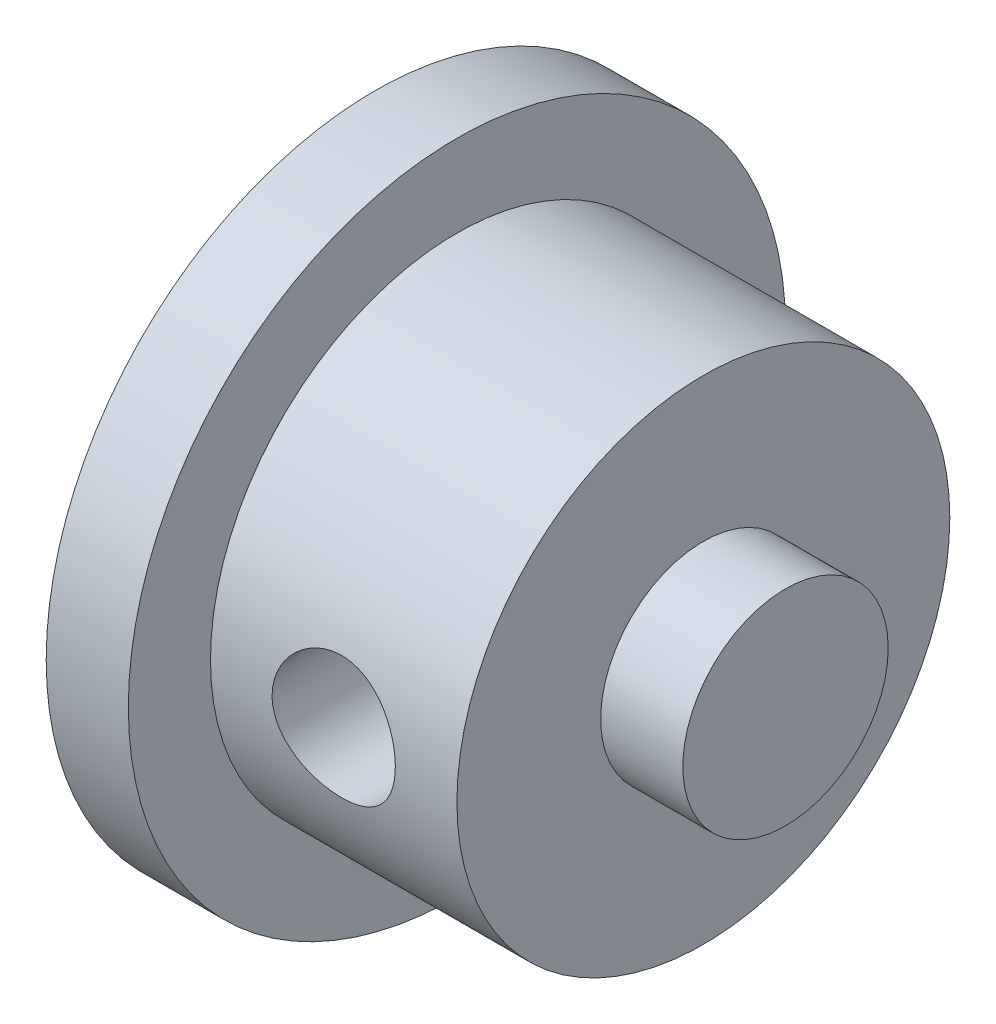
ISO-10303-21;
HEADER;
FILE_DESCRIPTION(('STEP AP214'),'2;1');
FILE_NAME('part.step','',(''),(''),'','','');
FILE_SCHEMA(('AUTOMOTIVE_DESIGN { 1 0 10303 214 1 1 1 1 }'));
ENDSEC;
DATA;
#1=APPLICATION_CONTEXT('core data for automotive mechanical design processes');
#2=APPLICATION_PROTOCOL_DEFINITION('international standard','automotive_design',2000,#1);
#3=PRODUCT_CONTEXT('',#1,'mechanical');
#4=PRODUCT('Part','Part','',(#3));
#5=PRODUCT_RELATED_PRODUCT_CATEGORY('part','',(#4));
#6=PRODUCT_DEFINITION_FORMATION('','',#4);
#7=PRODUCT_DEFINITION_CONTEXT('part definition',#1,'design');
#8=PRODUCT_DEFINITION('design','',#6,#7);
#9=PRODUCT_DEFINITION_SHAPE('','',#8);
#10=(LENGTH_UNIT() NAMED_UNIT(*) SI_UNIT(.MILLI.,.METRE.));
#11=(NAMED_UNIT(*) PLANE_ANGLE_UNIT() SI_UNIT($,.RADIAN.));
#12=(NAMED_UNIT(*) SI_UNIT($,.STERADIAN.) SOLID_ANGLE_UNIT());
#13=UNCERTAINTY_MEASURE_WITH_UNIT(LENGTH_MEASURE(1.E-05),#10,'distance_accuracy_value','');
#14=(GEOMETRIC_REPRESENTATION_CONTEXT(3) GLOBAL_UNCERTAINTY_ASSIGNED_CONTEXT((#13)) GLOBAL_UNIT_ASSIGNED_CONTEXT((#10,
#11,#12)) REPRESENTATION_CONTEXT('',''));
#15=CARTESIAN_POINT('',(0.,0.,0.));
#16=DIRECTION('',(0.,0.,1.));
#17=DIRECTION('',(1.,0.,0.));
#18=AXIS2_PLACEMENT_3D('',#15,#16,#17);
#19=CARTESIAN_POINT('',(-85.1360818211514,-18.2560029817697,0.));
#20=DIRECTION('',(-1.,0.,0.));
#21=DIRECTION('',(0.,0.,1.));
#22=AXIS2_PLACEMENT_3D('',#19,#20,#21);
#23=CYLINDRICAL_SURFACE('',#22,8.);
#24=CARTESIAN_POINT('',(-85.1360818211514,-18.2560029817697,0.));
#25=DIRECTION('',(-1.,0.,0.));
#26=DIRECTION('',(0.,0.,1.));
#27=AXIS2_PLACEMENT_3D('',#24,#25,#26);
#28=CIRCLE('',#27,8.);
#29=CARTESIAN_POINT('',(-85.1360818211514,-18.2560029817697,8.));
#30=VERTEX_POINT('',#29);
#31=EDGE_CURVE('E50',#30,#30,#28,.T.);
#32=ORIENTED_EDGE('',*,*,#31,.F.);
#33=EDGE_LOOP('',(#32));
#34=FACE_BOUND('',#33,.T.);
#35=CARTESIAN_POINT('',(-83.1360818211514,-18.2560029817697,0.));
#36=DIRECTION('',(-1.,0.,0.));
#37=DIRECTION('',(0.,0.,1.));
#38=AXIS2_PLACEMENT_3D('',#35,#36,#37);
#39=CIRCLE('',#38,8.);
#40=CARTESIAN_POINT('',(-83.1360818211514,-18.2560029817697,8.));
#41=VERTEX_POINT('',#40);
#42=EDGE_CURVE('E66',#41,#41,#39,.T.);
#43=ORIENTED_EDGE('',*,*,#42,.T.);
#44=EDGE_LOOP('',(#43));
#45=FACE_BOUND('',#44,.T.);
#46=ADVANCED_FACE('F37',(#34,#45),#23,.T.);
#47=CARTESIAN_POINT('',(-85.1360818211514,-10.2560029817697,0.));
#48=DIRECTION('',(1.,0.,0.));
#49=DIRECTION('',(0.,0.,-1.));
#50=AXIS2_PLACEMENT_3D('',#47,#48,#49);
#51=PLANE('',#50);
#52=ORIENTED_EDGE('',*,*,#31,.T.);
#53=EDGE_LOOP('',(#52));
#54=FACE_BOUND('',#53,.T.);
#55=ADVANCED_FACE('F94',(#54),#51,.F.);
#56=CARTESIAN_POINT('',(-85.1360818211514,-18.2560029817697,0.));
#57=DIRECTION('',(-1.,0.,0.));
#58=DIRECTION('',(0.,0.,1.));
#59=AXIS2_PLACEMENT_3D('',#56,#57,#58);
#60=CYLINDRICAL_SURFACE('',#59,6.);
#61=CARTESIAN_POINT('',(-78.6360818211514,-18.2560029817697,6.));
#62=CARTESIAN_POINT('',(-78.6360841468896,-18.3388790704394,5.99999859868013));
#63=CARTESIAN_POINT('',(-78.6429733719252,-18.4217811396004,5.99826578131828));
#64=CARTESIAN_POINT('',(-78.6703069724584,-18.5852093055402,5.99152113829892));
#65=CARTESIAN_POINT('',(-78.6907590306893,-18.6657340286404,5.98650745419968));
#66=CARTESIAN_POINT('',(-78.7445210746135,-18.8220238539523,5.9737562633204));
#67=CARTESIAN_POINT('',(-78.7778156198667,-18.8977945451997,5.96602202842087));
#68=CARTESIAN_POINT('',(-78.8562632111963,-19.0426751136741,5.94865343807593));
#69=CARTESIAN_POINT('',(-78.9014166572703,-19.1117847661184,5.9390190185405));
#70=CARTESIAN_POINT('',(-79.0032826108056,-19.2428049090706,5.91867413591801));
#71=CARTESIAN_POINT('',(-79.0601933961106,-19.3045586718308,5.90794707148533));
#72=CARTESIAN_POINT('',(-79.1835340260603,-19.417751908973,5.88673620117529));
#73=CARTESIAN_POINT('',(-79.2499649440979,-19.4691902187188,5.87625242288348));
#74=CARTESIAN_POINT('',(-79.3916770478888,-19.5610295245687,5.8565477569971));
#75=CARTESIAN_POINT('',(-79.4670750519618,-19.601255197695,5.84734794470605));
#76=CARTESIAN_POINT('',(-79.6238302328098,-19.6683998903202,5.83149494812223));
#77=CARTESIAN_POINT('',(-79.7051864544772,-19.695321037209,5.82484135672789));
#78=CARTESIAN_POINT('',(-79.8698253193539,-19.734557818574,5.81500476717551));
#79=CARTESIAN_POINT('',(-79.9530367172012,-19.747155250103,5.81175491075426));
#80=CARTESIAN_POINT('',(-80.1204503901654,-19.7582647568375,5.80889362537741));
#81=CARTESIAN_POINT('',(-80.20465250185,-19.7567791235876,5.80928160448644));
#82=CARTESIAN_POINT('',(-80.3694976288959,-19.7399895064089,5.81359205496618));
#83=CARTESIAN_POINT('',(-80.4501774426165,-19.7250213219602,5.81742863001879));
#84=CARTESIAN_POINT('',(-80.6078428720627,-19.6822271686728,5.82806709676484));
#85=CARTESIAN_POINT('',(-80.6848282241804,-19.6544002838391,5.83486919970697));
#86=CARTESIAN_POINT('',(-80.8338198374035,-19.5863924597068,5.85075113904187));
#87=CARTESIAN_POINT('',(-80.905767992941,-19.5460896490026,5.85985327469421));
#88=CARTESIAN_POINT('',(-81.0420005309083,-19.4543592577846,5.87929710846386));
#89=CARTESIAN_POINT('',(-81.1062835692187,-19.4029297305785,5.88963902334736));
#90=CARTESIAN_POINT('',(-81.2272854368458,-19.2886664064509,5.91075880539781));
#91=CARTESIAN_POINT('',(-81.2837363112128,-19.2255492399355,5.92154069477972));
#92=CARTESIAN_POINT('',(-81.3853030636153,-19.0906148992734,5.94205965578786));
#93=CARTESIAN_POINT('',(-81.430418595415,-19.0187974594776,5.95179669549415));
#94=CARTESIAN_POINT('',(-81.5081324073758,-18.8681188704511,5.96917732094183));
#95=CARTESIAN_POINT('',(-81.5406871614058,-18.7892343749783,5.97681360127725));
#96=CARTESIAN_POINT('',(-81.591999126861,-18.6268789899125,5.98907916991419));
#97=CARTESIAN_POINT('',(-81.6107589775695,-18.5434089809201,5.99370903339281));
#98=CARTESIAN_POINT('',(-81.6335393867102,-18.3765429521597,5.99935499271375));
#99=CARTESIAN_POINT('',(-81.6379248472267,-18.2931997017579,6.00046053508279));
#100=CARTESIAN_POINT('',(-81.6328328190959,-18.1269701069682,5.99918804814451));
#101=CARTESIAN_POINT('',(-81.6233565783523,-18.0440837221251,5.99681033241846));
#102=CARTESIAN_POINT('',(-81.59111091276,-17.8823887129932,5.98889581127357));
#103=CARTESIAN_POINT('',(-81.5685405576744,-17.8035378628009,5.98340634185811));
#104=CARTESIAN_POINT('',(-81.510974737123,-17.6507456893172,5.96988706634134));
#105=CARTESIAN_POINT('',(-81.4759780168382,-17.576804862737,5.96185700369892));
#106=CARTESIAN_POINT('',(-81.3938456922767,-17.4344798473398,5.9439330792631));
#107=CARTESIAN_POINT('',(-81.3465057087546,-17.3662175399338,5.93400867366932));
#108=CARTESIAN_POINT('',(-81.2412919123544,-17.2384763681264,5.91344509187419));
#109=CARTESIAN_POINT('',(-81.1834162815345,-17.1789990227967,5.90280579251705));
#110=CARTESIAN_POINT('',(-81.0570798603069,-17.0690124136969,5.88168956960771));
#111=CARTESIAN_POINT('',(-80.988394118149,-17.0187591141476,5.87122304187281));
#112=CARTESIAN_POINT('',(-80.8433491866857,-16.930492222757,5.85192878377239));
#113=CARTESIAN_POINT('',(-80.7669903381916,-16.8924780876117,5.84310098067026));
#114=CARTESIAN_POINT('',(-80.6091760987383,-16.8300515611604,5.82818094734665));
#115=CARTESIAN_POINT('',(-80.5277541928074,-16.8055585851156,5.82207255291906));
#116=CARTESIAN_POINT('',(-80.3617721832623,-16.7706573218159,5.81326744090183));
#117=CARTESIAN_POINT('',(-80.2772127701189,-16.760245954291,5.81056997719936));
#118=CARTESIAN_POINT('',(-80.1099607972962,-16.7539643914357,5.80894901203957));
#119=CARTESIAN_POINT('',(-80.0272843860267,-16.7576850839896,5.80991932728264));
#120=CARTESIAN_POINT('',(-79.8637779324834,-16.7786257034568,5.81527909007843));
#121=CARTESIAN_POINT('',(-79.7829478531377,-16.7958453590829,5.81966846891857));
#122=CARTESIAN_POINT('',(-79.625873362086,-16.8430716623269,5.83131260682722));
#123=CARTESIAN_POINT('',(-79.5496045159112,-16.8730015770893,5.83855015236309));
#124=CARTESIAN_POINT('',(-79.4031164384377,-16.9447380681646,5.85507755724829));
#125=CARTESIAN_POINT('',(-79.3328980479645,-16.9865462917355,5.86436770120773));
#126=CARTESIAN_POINT('',(-79.1985271921494,-17.0821352331325,5.88425634263512));
#127=CARTESIAN_POINT('',(-79.1345807477274,-17.1361998188574,5.89488264831757));
#128=CARTESIAN_POINT('',(-79.016534776356,-17.2542136105799,5.91608027246286));
#129=CARTESIAN_POINT('',(-78.9624375910384,-17.3181651605085,5.9266515772706));
#130=CARTESIAN_POINT('',(-78.8646705125868,-17.4555353950671,5.94677655647663));
#131=CARTESIAN_POINT('',(-78.8212072074798,-17.5291045594533,5.95630833365868));
#132=CARTESIAN_POINT('',(-78.7473343582109,-17.6827369222592,5.97304924975119));
#133=CARTESIAN_POINT('',(-78.7169154605029,-17.7627954183329,5.98026005199781));
#134=CARTESIAN_POINT('',(-78.6745099908218,-17.9115927285262,5.99048059565542));
#135=CARTESIAN_POINT('',(-78.660130578098,-17.9796228108616,5.99402585052691));
#136=CARTESIAN_POINT('',(-78.6409158775295,-18.1170969102334,5.99878605231948));
#137=CARTESIAN_POINT('',(-78.6360798718461,-18.1865408205271,6.00000117450894));
#138=CARTESIAN_POINT('',(-78.6360818211514,-18.2560029817697,6.));
#139=B_SPLINE_CURVE_WITH_KNOTS('',3,(#61,#62,#63,#64,#65,#66,#67,#68,#69,#70,#71,#72,#73,#74,
#75,#76,#77,#78,#79,#80,#81,#82,#83,#84,#85,#86,#87,#88,#89,#90,#91,#92,#93,#94,#95,#96,#97,#98,
#99,#100,#101,#102,#103,#104,#105,#106,#107,#108,#109,#110,#111,#112,#113,#114,#115,#116,#117,
#118,#119,#120,#121,#122,#123,#124,#125,#126,#127,#128,#129,#130,#131,#132,#133,#134,#135,#136,
#137,#138),.UNSPECIFIED.,.T.,.F.,(4,2,2,2,2,2,2,2,2,2,2,2,2,2,2,2,2,2,2,2,2,2,2,2,2,2,2,2,2,2,2,
2,2,2,2,2,2,2,4),(0.,0.248373712471887,0.496888237763901,0.745104902286106,0.993329940169331,
1.2461443543714,1.49898729580063,1.75558647545808,2.01214461169367,2.26356295099428,
2.51494038112696,2.76022497007017,3.00552703466038,3.2533052787388,3.50112690836163,
3.75601500969019,4.01091089558247,4.26668229009114,4.52240473688643,4.77158308949276,
5.02073901112742,5.26620274514037,5.5116912732229,5.76153587565351,6.01142363008018,
6.26744509204475,6.52345518749507,6.77792254614035,7.03233423252408,7.27943780398612,
7.52653640956035,7.77216400559447,8.017825681369,8.26989576409909,8.52202569770418,
8.77872185499588,9.03523363821349,9.24342242942148,9.45159556043038),.UNSPECIFIED.);
#140=CARTESIAN_POINT('',(-78.6360818211514,-18.2560029817697,6.));
#141=VERTEX_POINT('',#140);
#142=EDGE_CURVE('E40',#141,#141,#139,.T.);
#143=ORIENTED_EDGE('',*,*,#142,.T.);
#144=EDGE_LOOP('',(#143));
#145=FACE_BOUND('',#144,.T.);
#146=CARTESIAN_POINT('',(-78.6360818211514,-18.2560029817697,-6.));
#147=CARTESIAN_POINT('',(-78.6360841468896,-18.1731268930999,-5.99999859868013));
#148=CARTESIAN_POINT('',(-78.6429733719252,-18.0902248239389,-5.99826578131828));
#149=CARTESIAN_POINT('',(-78.6703069724584,-17.9267966579991,-5.99152113829892));
#150=CARTESIAN_POINT('',(-78.6907590306893,-17.8462719348989,-5.98650745419968));
#151=CARTESIAN_POINT('',(-78.7445210746135,-17.6899821095871,-5.9737562633204));
#152=CARTESIAN_POINT('',(-78.7778156198667,-17.6142114183397,-5.96602202842087));
#153=CARTESIAN_POINT('',(-78.8562632111963,-17.4693308498652,-5.94865343807593));
#154=CARTESIAN_POINT('',(-78.9014166572703,-17.4002211974209,-5.9390190185405));
#155=CARTESIAN_POINT('',(-79.0032826108056,-17.2692010544688,-5.91867413591801));
#156=CARTESIAN_POINT('',(-79.0601933961106,-17.2074472917086,-5.90794707148533));
#157=CARTESIAN_POINT('',(-79.1835340260603,-17.0942540545664,-5.88673620117529));
#158=CARTESIAN_POINT('',(-79.2499649440979,-17.0428157448205,-5.87625242288348));
#159=CARTESIAN_POINT('',(-79.3916770478888,-16.9509764389706,-5.8565477569971));
#160=CARTESIAN_POINT('',(-79.4670750519618,-16.9107507658443,-5.84734794470605));
#161=CARTESIAN_POINT('',(-79.6238302328098,-16.8436060732191,-5.83149494812223));
#162=CARTESIAN_POINT('',(-79.7051864544772,-16.8166849263303,-5.82484135672789));
#163=CARTESIAN_POINT('',(-79.8698253193539,-16.7774481449654,-5.81500476717551));
#164=CARTESIAN_POINT('',(-79.9530367172012,-16.7648507134363,-5.81175491075426));
#165=CARTESIAN_POINT('',(-80.1204503901654,-16.7537412067018,-5.80889362537741));
#166=CARTESIAN_POINT('',(-80.20465250185,-16.7552268399517,-5.80928160448644));
#167=CARTESIAN_POINT('',(-80.3694976288959,-16.7720164571304,-5.81359205496618));
#168=CARTESIAN_POINT('',(-80.4501774426165,-16.7869846415792,-5.81742863001879));
#169=CARTESIAN_POINT('',(-80.6078428720627,-16.8297787948666,-5.82806709676484));
#170=CARTESIAN_POINT('',(-80.6848282241804,-16.8576056797003,-5.83486919970696));
#171=CARTESIAN_POINT('',(-80.8338198374035,-16.9256135038325,-5.85075113904187));
#172=CARTESIAN_POINT('',(-80.905767992941,-16.9659163145368,-5.85985327469421));
#173=CARTESIAN_POINT('',(-81.0420005309083,-17.0576467057547,-5.87929710846386));
#174=CARTESIAN_POINT('',(-81.1062835692187,-17.1090762329608,-5.88963902334735));
#175=CARTESIAN_POINT('',(-81.2272854368458,-17.2233395570885,-5.91075880539781));
#176=CARTESIAN_POINT('',(-81.2837363112128,-17.2864567236038,-5.92154069477971));
#177=CARTESIAN_POINT('',(-81.3853030636153,-17.421391064266,-5.94205965578786));
#178=CARTESIAN_POINT('',(-81.430418595415,-17.4932085040617,-5.95179669549415));
#179=CARTESIAN_POINT('',(-81.5081324073758,-17.6438870930883,-5.96917732094182));
#180=CARTESIAN_POINT('',(-81.5406871614058,-17.722771588561,-5.97681360127725));
#181=CARTESIAN_POINT('',(-81.591999126861,-17.8851269736268,-5.98907916991418));
#182=CARTESIAN_POINT('',(-81.6107589775695,-17.9685969826192,-5.99370903339281));
#183=CARTESIAN_POINT('',(-81.6335393867102,-18.1354630113797,-5.99935499271375));
#184=CARTESIAN_POINT('',(-81.6379248472267,-18.2188062617815,-6.00046053508279));
#185=CARTESIAN_POINT('',(-81.6328328190959,-18.3850358565712,-5.99918804814451));
#186=CARTESIAN_POINT('',(-81.6233565783523,-18.4679222414143,-5.99681033241846));
#187=CARTESIAN_POINT('',(-81.59111091276,-18.6296172505462,-5.98889581127357));
#188=CARTESIAN_POINT('',(-81.5685405576744,-18.7084681007384,-5.98340634185811));
#189=CARTESIAN_POINT('',(-81.510974737123,-18.8612602742222,-5.96988706634134));
#190=CARTESIAN_POINT('',(-81.4759780168382,-18.9352011008023,-5.96185700369892));
#191=CARTESIAN_POINT('',(-81.3938456922767,-19.0775261161995,-5.9439330792631));
#192=CARTESIAN_POINT('',(-81.3465057087546,-19.1457884236055,-5.93400867366932));
#193=CARTESIAN_POINT('',(-81.2412919123544,-19.2735295954129,-5.91344509187419));
#194=CARTESIAN_POINT('',(-81.1834162815345,-19.3330069407427,-5.90280579251705));
#195=CARTESIAN_POINT('',(-81.0570798603069,-19.4429935498424,-5.88168956960771));
#196=CARTESIAN_POINT('',(-80.988394118149,-19.4932468493917,-5.87122304187281));
#197=CARTESIAN_POINT('',(-80.8433491866857,-19.5815137407824,-5.85192878377239));
#198=CARTESIAN_POINT('',(-80.7669903381916,-19.6195278759276,-5.84310098067026));
#199=CARTESIAN_POINT('',(-80.6091760987383,-19.681954402379,-5.82818094734665));
#200=CARTESIAN_POINT('',(-80.5277541928074,-19.7064473784237,-5.82207255291906));
#201=CARTESIAN_POINT('',(-80.3617721832623,-19.7413486417234,-5.81326744090184));
#202=CARTESIAN_POINT('',(-80.2772127701189,-19.7517600092483,-5.81056997719936));
#203=CARTESIAN_POINT('',(-80.1099607972962,-19.7580415721037,-5.80894901203957));
#204=CARTESIAN_POINT('',(-80.0272843860267,-19.7543208795498,-5.80991932728264));
#205=CARTESIAN_POINT('',(-79.8637779324834,-19.7333802600825,-5.81527909007843));
#206=CARTESIAN_POINT('',(-79.7829478531377,-19.7161606044564,-5.81966846891857));
#207=CARTESIAN_POINT('',(-79.625873362086,-19.6689343012125,-5.83131260682723));
#208=CARTESIAN_POINT('',(-79.5496045159112,-19.63900438645,-5.8385501523631));
#209=CARTESIAN_POINT('',(-79.4031164384377,-19.5672678953747,-5.85507755724829));
#210=CARTESIAN_POINT('',(-79.3328980479645,-19.5254596718039,-5.86436770120773));
#211=CARTESIAN_POINT('',(-79.1985271921494,-19.4298707304068,-5.88425634263512));
#212=CARTESIAN_POINT('',(-79.1345807477274,-19.3758061446819,-5.89488264831757));
#213=CARTESIAN_POINT('',(-79.016534776356,-19.2577923529594,-5.91608027246286));
#214=CARTESIAN_POINT('',(-78.9624375910384,-19.1938408030308,-5.9266515772706));
#215=CARTESIAN_POINT('',(-78.8646705125868,-19.0564705684723,-5.94677655647663));
#216=CARTESIAN_POINT('',(-78.8212072074798,-18.9829014040861,-5.95630833365868));
#217=CARTESIAN_POINT('',(-78.7473343582109,-18.8292690412801,-5.97304924975118));
#218=CARTESIAN_POINT('',(-78.7169154605029,-18.7492105452064,-5.98026005199781));
#219=CARTESIAN_POINT('',(-78.6745099908218,-18.6004132350131,-5.99048059565542));
#220=CARTESIAN_POINT('',(-78.660130578098,-18.5323831526777,-5.99402585052691));
#221=CARTESIAN_POINT('',(-78.6409158775295,-18.394909053306,-5.99878605231948));
#222=CARTESIAN_POINT('',(-78.6360798718461,-18.3254651430123,-6.00000117450894));
#223=CARTESIAN_POINT('',(-78.6360818211514,-18.2560029817697,-6.));
#224=B_SPLINE_CURVE_WITH_KNOTS('',3,(#146,#147,#148,#149,#150,#151,#152,#153,#154,#155,#156,
#157,#158,#159,#160,#161,#162,#163,#164,#165,#166,#167,#168,#169,#170,#171,#172,#173,#174,#175,
#176,#177,#178,#179,#180,#181,#182,#183,#184,#185,#186,#187,#188,#189,#190,#191,#192,#193,#194,
#195,#196,#197,#198,#199,#200,#201,#202,#203,#204,#205,#206,#207,#208,#209,#210,#211,#212,#213,
#214,#215,#216,#217,#218,#219,#220,#221,#222,#223),.UNSPECIFIED.,.T.,.F.,(4,2,2,2,2,2,2,2,2,2,2,
2,2,2,2,2,2,2,2,2,2,2,2,2,2,2,2,2,2,2,2,2,2,2,2,2,2,2,4),(0.,0.248373712471891,
0.496888237763901,0.745104902286109,0.993329940169328,1.2461443543714,1.49898729580061,
1.75558647545806,2.01214461169367,2.2635629509943,2.51494038112696,2.76022497007017,
3.00552703466038,3.25330527873879,3.50112690836162,3.75601500969018,4.01091089558246,
4.26668229009113,4.52240473688643,4.77158308949276,5.02073901112742,5.26620274514037,
5.5116912732229,5.76153587565352,6.01142363008018,6.26744509204475,6.52345518749507,
6.77792254614035,7.03233423252407,7.27943780398612,7.52653640956034,7.77216400559447,
8.01782568136901,8.26989576409909,8.52202569770416,8.77872185499587,9.03523363821349,
9.24342242942148,9.45159556043038),.UNSPECIFIED.);
#225=CARTESIAN_POINT('',(-78.6360818211514,-18.2560029817697,-6.));
#226=VERTEX_POINT('',#225);
#227=EDGE_CURVE('E65',#226,#226,#224,.T.);
#228=ORIENTED_EDGE('',*,*,#227,.T.);
#229=EDGE_LOOP('',(#228));
#230=FACE_BOUND('',#229,.T.);
#231=CARTESIAN_POINT('',(-83.1360818211514,-18.2560029817697,0.));
#232=DIRECTION('',(-1.,0.,0.));
#233=DIRECTION('',(0.,0.,1.));
#234=AXIS2_PLACEMENT_3D('',#231,#232,#233);
#235=CIRCLE('',#234,6.);
#236=CARTESIAN_POINT('',(-83.1360818211514,-18.2560029817697,6.));
#237=VERTEX_POINT('',#236);
#238=EDGE_CURVE('E56',#237,#237,#235,.T.);
#239=ORIENTED_EDGE('',*,*,#238,.F.);
#240=EDGE_LOOP('',(#239));
#241=FACE_BOUND('',#240,.T.);
#242=CARTESIAN_POINT('',(-77.1360818211514,-18.2560029817697,0.));
#243=DIRECTION('',(1.,0.,0.));
#244=DIRECTION('',(0.,0.,-1.));
#245=AXIS2_PLACEMENT_3D('',#242,#243,#244);
#246=CIRCLE('',#245,6.);
#247=CARTESIAN_POINT('',(-77.1360818211514,-18.2560029817697,-6.));
#248=VERTEX_POINT('',#247);
#249=EDGE_CURVE('E61',#248,#248,#246,.T.);
#250=ORIENTED_EDGE('',*,*,#249,.F.);
#251=EDGE_LOOP('',(#250));
#252=FACE_BOUND('',#251,.T.);
#253=ADVANCED_FACE('F77',(#145,#230,#241,#252),#60,.T.);
#254=CARTESIAN_POINT('',(-83.1360818211514,-12.2560029817697,0.));
#255=DIRECTION('',(-1.,0.,0.));
#256=DIRECTION('',(0.,0.,1.));
#257=AXIS2_PLACEMENT_3D('',#254,#255,#256);
#258=PLANE('',#257);
#259=ORIENTED_EDGE('',*,*,#42,.F.);
#260=EDGE_LOOP('',(#259));
#261=FACE_BOUND('',#260,.T.);
#262=ORIENTED_EDGE('',*,*,#238,.T.);
#263=EDGE_LOOP('',(#262));
#264=FACE_BOUND('',#263,.T.);
#265=ADVANCED_FACE('F85',(#261,#264),#258,.F.);
#266=CARTESIAN_POINT('',(-80.1360818211514,-18.2560029817697,-8.00000000000002));
#267=DIRECTION('',(0.,0.,1.));
#268=DIRECTION('',(1.,0.,0.));
#269=AXIS2_PLACEMENT_3D('',#266,#267,#268);
#270=CYLINDRICAL_SURFACE('',#269,1.5);
#271=ORIENTED_EDGE('',*,*,#227,.F.);
#272=EDGE_LOOP('',(#271));
#273=FACE_BOUND('',#272,.T.);
#274=ORIENTED_EDGE('',*,*,#142,.F.);
#275=EDGE_LOOP('',(#274));
#276=FACE_BOUND('',#275,.T.);
#277=ADVANCED_FACE('F80',(#273,#276),#270,.F.);
#278=CARTESIAN_POINT('',(-77.1360818211514,-18.2560029817697,0.));
#279=DIRECTION('',(1.,0.,0.));
#280=DIRECTION('',(0.,0.,-1.));
#281=AXIS2_PLACEMENT_3D('',#278,#279,#280);
#282=PLANE('',#281);
#283=CARTESIAN_POINT('',(-77.1360818211514,-18.2560029817697,0.));
#284=DIRECTION('',(1.,0.,0.));
#285=DIRECTION('',(0.,0.,-1.));
#286=AXIS2_PLACEMENT_3D('',#283,#284,#285);
#287=CIRCLE('',#286,2.5);
#288=CARTESIAN_POINT('',(-77.1360818211514,-18.2560029817697,-2.5));
#289=VERTEX_POINT('',#288);
#290=EDGE_CURVE('E10',#289,#289,#287,.T.);
#291=ORIENTED_EDGE('',*,*,#290,.F.);
#292=EDGE_LOOP('',(#291));
#293=FACE_BOUND('',#292,.T.);
#294=ORIENTED_EDGE('',*,*,#249,.T.);
#295=EDGE_LOOP('',(#294));
#296=FACE_BOUND('',#295,.T.);
#297=ADVANCED_FACE('F84',(#293,#296),#282,.T.);
#298=CARTESIAN_POINT('',(-75.1360818211514,-18.2560029817697,0.));
#299=DIRECTION('',(-1.,0.,0.));
#300=DIRECTION('',(0.,0.,1.));
#301=AXIS2_PLACEMENT_3D('',#298,#299,#300);
#302=CYLINDRICAL_SURFACE('',#301,2.5);
#303=CARTESIAN_POINT('',(-75.1360818211514,-18.2560029817697,0.));
#304=DIRECTION('',(1.,0.,0.));
#305=DIRECTION('',(0.,0.,-1.));
#306=AXIS2_PLACEMENT_3D('',#303,#304,#305);
#307=CIRCLE('',#306,2.5);
#308=CARTESIAN_POINT('',(-75.1360818211514,-18.2560029817697,-2.5));
#309=VERTEX_POINT('',#308);
#310=EDGE_CURVE('E60',#309,#309,#307,.T.);
#311=ORIENTED_EDGE('',*,*,#310,.F.);
#312=EDGE_LOOP('',(#311));
#313=FACE_BOUND('',#312,.T.);
#314=ORIENTED_EDGE('',*,*,#290,.T.);
#315=EDGE_LOOP('',(#314));
#316=FACE_BOUND('',#315,.T.);
#317=ADVANCED_FACE('F129',(#313,#316),#302,.T.);
#318=CARTESIAN_POINT('',(-75.1360818211514,-18.2560029817697,0.));
#319=DIRECTION('',(1.,0.,0.));
#320=DIRECTION('',(0.,0.,-1.));
#321=AXIS2_PLACEMENT_3D('',#318,#319,#320);
#322=PLANE('',#321);
#323=ORIENTED_EDGE('',*,*,#310,.T.);
#324=EDGE_LOOP('',(#323));
#325=FACE_BOUND('',#324,.T.);
#326=ADVANCED_FACE('F138',(#325),#322,.T.);
#327=CLOSED_SHELL('',(#46,#55,#253,#265,#277,#297,#317,#326));
#328=MANIFOLD_SOLID_BREP('B2',#327);
#329=ADVANCED_BREP_SHAPE_REPRESENTATION('',(#18,#328),#14);
#330=SHAPE_DEFINITION_REPRESENTATION(#9,#329);
ENDSEC;
END-ISO-10303-21;
